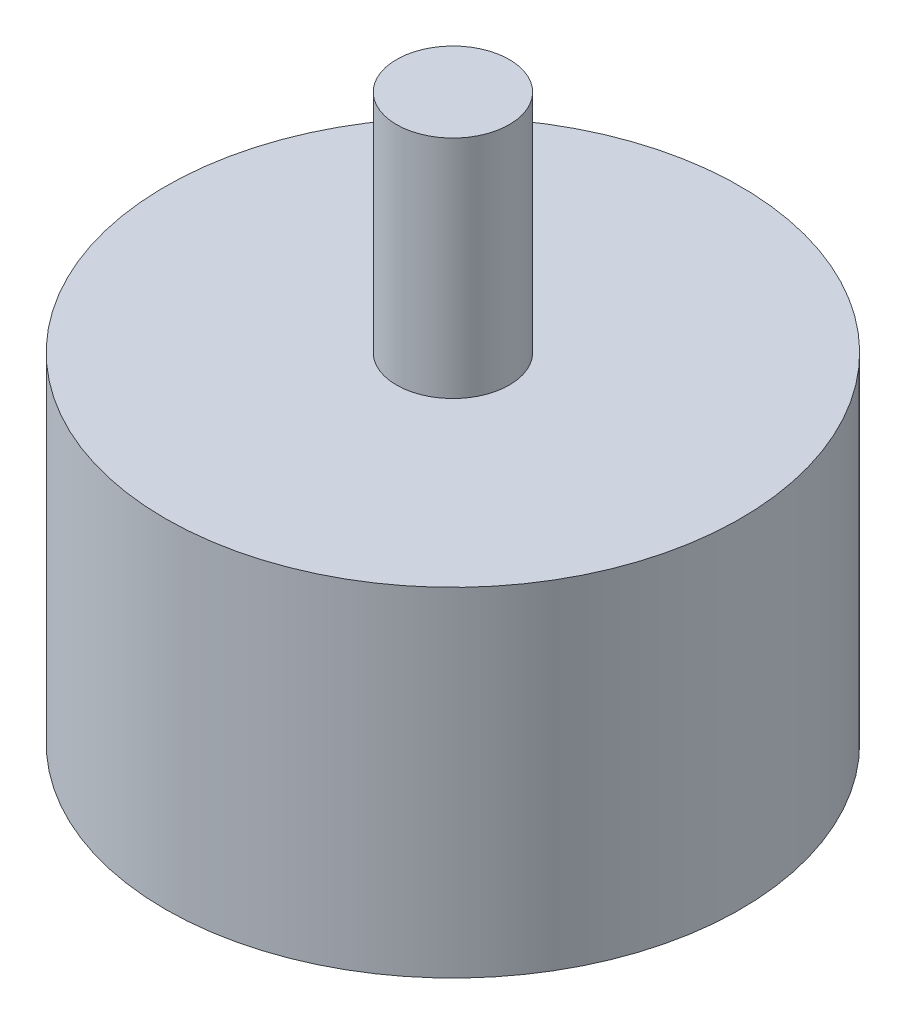
ISO-10303-21;
HEADER;
FILE_DESCRIPTION(('STEP AP214'),'2;1');
FILE_NAME('part.step','',(''),(''),'','','');
FILE_SCHEMA(('AUTOMOTIVE_DESIGN { 1 0 10303 214 1 1 1 1 }'));
ENDSEC;
DATA;
#1=APPLICATION_CONTEXT('core data for automotive mechanical design processes');
#2=APPLICATION_PROTOCOL_DEFINITION('international standard','automotive_design',2000,#1);
#3=PRODUCT_CONTEXT('',#1,'mechanical');
#4=PRODUCT('Part','Part','',(#3));
#5=PRODUCT_RELATED_PRODUCT_CATEGORY('part','',(#4));
#6=PRODUCT_DEFINITION_FORMATION('','',#4);
#7=PRODUCT_DEFINITION_CONTEXT('part definition',#1,'design');
#8=PRODUCT_DEFINITION('design','',#6,#7);
#9=PRODUCT_DEFINITION_SHAPE('','',#8);
#10=(LENGTH_UNIT() NAMED_UNIT(*) SI_UNIT(.MILLI.,.METRE.));
#11=(NAMED_UNIT(*) PLANE_ANGLE_UNIT() SI_UNIT($,.RADIAN.));
#12=(NAMED_UNIT(*) SI_UNIT($,.STERADIAN.) SOLID_ANGLE_UNIT());
#13=UNCERTAINTY_MEASURE_WITH_UNIT(LENGTH_MEASURE(1.E-05),#10,'distance_accuracy_value','');
#14=(GEOMETRIC_REPRESENTATION_CONTEXT(3) GLOBAL_UNCERTAINTY_ASSIGNED_CONTEXT((#13)) GLOBAL_UNIT_ASSIGNED_CONTEXT((#10,
#11,#12)) REPRESENTATION_CONTEXT('',''));
#15=CARTESIAN_POINT('',(0.,0.,0.));
#16=DIRECTION('',(0.,0.,1.));
#17=DIRECTION('',(1.,0.,0.));
#18=AXIS2_PLACEMENT_3D('',#15,#16,#17);
#19=CARTESIAN_POINT('',(0.,15.,0.));
#20=DIRECTION('',(0.,-1.,0.));
#21=DIRECTION('',(0.,0.,-1.));
#22=AXIS2_PLACEMENT_3D('',#19,#20,#21);
#23=CYLINDRICAL_SURFACE('',#22,12.75);
#24=CARTESIAN_POINT('',(0.,15.,0.));
#25=DIRECTION('',(0.,1.,0.));
#26=DIRECTION('',(0.,0.,1.));
#27=AXIS2_PLACEMENT_3D('',#24,#25,#26);
#28=CIRCLE('',#27,12.75);
#29=CARTESIAN_POINT('',(0.,15.,12.75));
#30=VERTEX_POINT('',#29);
#31=EDGE_CURVE('E42',#30,#30,#28,.T.);
#32=ORIENTED_EDGE('',*,*,#31,.F.);
#33=EDGE_LOOP('',(#32));
#34=FACE_BOUND('',#33,.T.);
#35=CARTESIAN_POINT('',(0.,0.,0.));
#36=DIRECTION('',(0.,1.,0.));
#37=DIRECTION('',(0.,0.,1.));
#38=AXIS2_PLACEMENT_3D('',#35,#36,#37);
#39=CIRCLE('',#38,12.75);
#40=CARTESIAN_POINT('',(0.,0.,12.75));
#41=VERTEX_POINT('',#40);
#42=EDGE_CURVE('E38',#41,#41,#39,.T.);
#43=ORIENTED_EDGE('',*,*,#42,.T.);
#44=EDGE_LOOP('',(#43));
#45=FACE_BOUND('',#44,.T.);
#46=ADVANCED_FACE('F35',(#34,#45),#23,.T.);
#47=CARTESIAN_POINT('',(0.,15.,0.));
#48=DIRECTION('',(0.,1.,0.));
#49=DIRECTION('',(0.,0.,1.));
#50=AXIS2_PLACEMENT_3D('',#47,#48,#49);
#51=PLANE('',#50);
#52=CARTESIAN_POINT('',(0.,15.,0.));
#53=DIRECTION('',(0.,1.,0.));
#54=DIRECTION('',(0.,0.,1.));
#55=AXIS2_PLACEMENT_3D('',#52,#53,#54);
#56=CIRCLE('',#55,2.5);
#57=CARTESIAN_POINT('',(0.,15.,2.5));
#58=VERTEX_POINT('',#57);
#59=EDGE_CURVE('E10',#58,#58,#56,.T.);
#60=ORIENTED_EDGE('',*,*,#59,.F.);
#61=EDGE_LOOP('',(#60));
#62=FACE_BOUND('',#61,.T.);
#63=ORIENTED_EDGE('',*,*,#31,.T.);
#64=EDGE_LOOP('',(#63));
#65=FACE_BOUND('',#64,.T.);
#66=ADVANCED_FACE('F59',(#62,#65),#51,.T.);
#67=CARTESIAN_POINT('',(0.,0.,0.));
#68=DIRECTION('',(0.,1.,0.));
#69=DIRECTION('',(0.,0.,1.));
#70=AXIS2_PLACEMENT_3D('',#67,#68,#69);
#71=PLANE('',#70);
#72=ORIENTED_EDGE('',*,*,#42,.F.);
#73=EDGE_LOOP('',(#72));
#74=FACE_BOUND('',#73,.T.);
#75=ADVANCED_FACE('F56',(#74),#71,.F.);
#76=CARTESIAN_POINT('',(0.,25.,0.));
#77=DIRECTION('',(0.,-1.,0.));
#78=DIRECTION('',(0.,0.,-1.));
#79=AXIS2_PLACEMENT_3D('',#76,#77,#78);
#80=CYLINDRICAL_SURFACE('',#79,2.5);
#81=CARTESIAN_POINT('',(0.,25.,0.));
#82=DIRECTION('',(0.,1.,0.));
#83=DIRECTION('',(0.,0.,1.));
#84=AXIS2_PLACEMENT_3D('',#81,#82,#83);
#85=CIRCLE('',#84,2.5);
#86=CARTESIAN_POINT('',(0.,25.,2.5));
#87=VERTEX_POINT('',#86);
#88=EDGE_CURVE('E48',#87,#87,#85,.T.);
#89=ORIENTED_EDGE('',*,*,#88,.F.);
#90=EDGE_LOOP('',(#89));
#91=FACE_BOUND('',#90,.T.);
#92=ORIENTED_EDGE('',*,*,#59,.T.);
#93=EDGE_LOOP('',(#92));
#94=FACE_BOUND('',#93,.T.);
#95=ADVANCED_FACE('F58',(#91,#94),#80,.T.);
#96=CARTESIAN_POINT('',(0.,25.,0.));
#97=DIRECTION('',(0.,1.,0.));
#98=DIRECTION('',(0.,0.,1.));
#99=AXIS2_PLACEMENT_3D('',#96,#97,#98);
#100=PLANE('',#99);
#101=ORIENTED_EDGE('',*,*,#88,.T.);
#102=EDGE_LOOP('',(#101));
#103=FACE_BOUND('',#102,.T.);
#104=ADVANCED_FACE('F64',(#103),#100,.T.);
#105=CLOSED_SHELL('',(#46,#66,#75,#95,#104));
#106=MANIFOLD_SOLID_BREP('B2',#105);
#107=ADVANCED_BREP_SHAPE_REPRESENTATION('',(#18,#106),#14);
#108=SHAPE_DEFINITION_REPRESENTATION(#9,#107);
ENDSEC;
END-ISO-10303-21;
